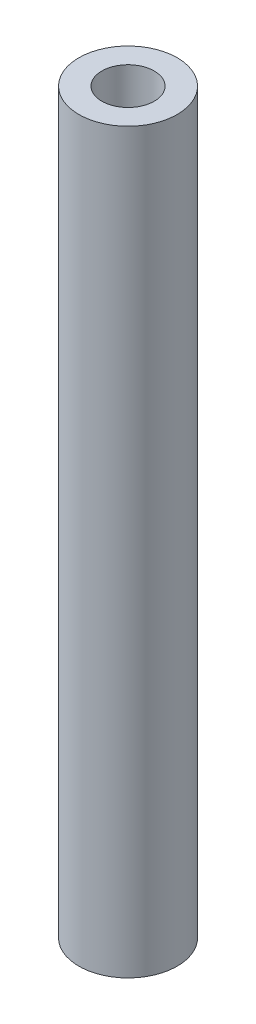
ISO-10303-21;
HEADER;
FILE_DESCRIPTION(('STEP AP214'),'2;1');
FILE_NAME('part.step','',(''),(''),'','','');
FILE_SCHEMA(('AUTOMOTIVE_DESIGN { 1 0 10303 214 1 1 1 1 }'));
ENDSEC;
DATA;
#1=APPLICATION_CONTEXT('core data for automotive mechanical design processes');
#2=APPLICATION_PROTOCOL_DEFINITION('international standard','automotive_design',2000,#1);
#3=PRODUCT_CONTEXT('',#1,'mechanical');
#4=PRODUCT('Part','Part','',(#3));
#5=PRODUCT_RELATED_PRODUCT_CATEGORY('part','',(#4));
#6=PRODUCT_DEFINITION_FORMATION('','',#4);
#7=PRODUCT_DEFINITION_CONTEXT('part definition',#1,'design');
#8=PRODUCT_DEFINITION('design','',#6,#7);
#9=PRODUCT_DEFINITION_SHAPE('','',#8);
#10=(LENGTH_UNIT() NAMED_UNIT(*) SI_UNIT(.MILLI.,.METRE.));
#11=(NAMED_UNIT(*) PLANE_ANGLE_UNIT() SI_UNIT($,.RADIAN.));
#12=(NAMED_UNIT(*) SI_UNIT($,.STERADIAN.) SOLID_ANGLE_UNIT());
#13=UNCERTAINTY_MEASURE_WITH_UNIT(LENGTH_MEASURE(1.E-05),#10,'distance_accuracy_value','');
#14=(GEOMETRIC_REPRESENTATION_CONTEXT(3) GLOBAL_UNCERTAINTY_ASSIGNED_CONTEXT((#13)) GLOBAL_UNIT_ASSIGNED_CONTEXT((#10,
#11,#12)) REPRESENTATION_CONTEXT('',''));
#15=CARTESIAN_POINT('',(0.,0.,0.));
#16=DIRECTION('',(0.,0.,1.));
#17=DIRECTION('',(1.,0.,0.));
#18=AXIS2_PLACEMENT_3D('',#15,#16,#17);
#19=CARTESIAN_POINT('',(0.,45.,0.));
#20=DIRECTION('',(0.,1.,0.));
#21=DIRECTION('',(0.,0.,1.));
#22=AXIS2_PLACEMENT_3D('',#19,#20,#21);
#23=PLANE('',#22);
#24=CARTESIAN_POINT('',(0.,45.,0.));
#25=DIRECTION('',(0.,1.,0.));
#26=DIRECTION('',(0.,0.,1.));
#27=AXIS2_PLACEMENT_3D('',#24,#25,#26);
#28=CIRCLE('',#27,3.);
#29=CARTESIAN_POINT('',(0.,45.,-3.));
#30=VERTEX_POINT('',#29);
#31=EDGE_CURVE('E10',#30,#30,#28,.T.);
#32=ORIENTED_EDGE('',*,*,#31,.T.);
#33=EDGE_LOOP('',(#32));
#34=FACE_BOUND('',#33,.T.);
#35=CARTESIAN_POINT('',(0.,45.,0.));
#36=DIRECTION('',(0.,1.,0.));
#37=DIRECTION('',(0.,0.,1.));
#38=AXIS2_PLACEMENT_3D('',#35,#36,#37);
#39=CIRCLE('',#38,1.6);
#40=CARTESIAN_POINT('',(0.,45.,-1.6));
#41=VERTEX_POINT('',#40);
#42=EDGE_CURVE('E50',#41,#41,#39,.T.);
#43=ORIENTED_EDGE('',*,*,#42,.F.);
#44=EDGE_LOOP('',(#43));
#45=FACE_BOUND('',#44,.T.);
#46=ADVANCED_FACE('F37',(#34,#45),#23,.T.);
#47=CARTESIAN_POINT('',(0.,0.,0.));
#48=DIRECTION('',(0.,1.,0.));
#49=DIRECTION('',(0.,0.,1.));
#50=AXIS2_PLACEMENT_3D('',#47,#48,#49);
#51=PLANE('',#50);
#52=CARTESIAN_POINT('',(0.,0.,0.));
#53=DIRECTION('',(0.,1.,0.));
#54=DIRECTION('',(0.,0.,1.));
#55=AXIS2_PLACEMENT_3D('',#52,#53,#54);
#56=CIRCLE('',#55,3.);
#57=CARTESIAN_POINT('',(0.,0.,-3.));
#58=VERTEX_POINT('',#57);
#59=EDGE_CURVE('E41',#58,#58,#56,.T.);
#60=ORIENTED_EDGE('',*,*,#59,.F.);
#61=EDGE_LOOP('',(#60));
#62=FACE_BOUND('',#61,.T.);
#63=CARTESIAN_POINT('',(0.,0.,0.));
#64=DIRECTION('',(0.,1.,0.));
#65=DIRECTION('',(0.,0.,1.));
#66=AXIS2_PLACEMENT_3D('',#63,#64,#65);
#67=CIRCLE('',#66,1.6);
#68=CARTESIAN_POINT('',(0.,0.,-1.6));
#69=VERTEX_POINT('',#68);
#70=EDGE_CURVE('E52',#69,#69,#67,.T.);
#71=ORIENTED_EDGE('',*,*,#70,.T.);
#72=EDGE_LOOP('',(#71));
#73=FACE_BOUND('',#72,.T.);
#74=ADVANCED_FACE('F64',(#62,#73),#51,.F.);
#75=CARTESIAN_POINT('',(0.,45.,0.));
#76=DIRECTION('',(0.,-1.,0.));
#77=DIRECTION('',(0.,0.,-1.));
#78=AXIS2_PLACEMENT_3D('',#75,#76,#77);
#79=CYLINDRICAL_SURFACE('',#78,3.);
#80=CARTESIAN_POINT('',(0.,45.,-3.));
#81=CARTESIAN_POINT('',(0.,44.53125,-3.));
#82=CARTESIAN_POINT('',(0.,44.0625,-3.));
#83=CARTESIAN_POINT('',(0.,43.125,-3.));
#84=CARTESIAN_POINT('',(0.,42.65625,-3.));
#85=CARTESIAN_POINT('',(0.,41.71875,-3.));
#86=CARTESIAN_POINT('',(0.,41.25,-3.));
#87=CARTESIAN_POINT('',(0.,40.3125,-3.));
#88=CARTESIAN_POINT('',(0.,39.84375,-3.));
#89=CARTESIAN_POINT('',(0.,38.90625,-3.));
#90=CARTESIAN_POINT('',(0.,38.4375,-3.));
#91=CARTESIAN_POINT('',(0.,37.5,-3.));
#92=CARTESIAN_POINT('',(0.,37.03125,-3.));
#93=CARTESIAN_POINT('',(0.,36.09375,-3.));
#94=CARTESIAN_POINT('',(0.,35.625,-3.));
#95=CARTESIAN_POINT('',(0.,34.6875,-3.));
#96=CARTESIAN_POINT('',(0.,34.21875,-3.));
#97=CARTESIAN_POINT('',(0.,33.28125,-3.));
#98=CARTESIAN_POINT('',(0.,32.8125,-3.));
#99=CARTESIAN_POINT('',(0.,31.875,-3.));
#100=CARTESIAN_POINT('',(0.,31.40625,-3.));
#101=CARTESIAN_POINT('',(0.,30.46875,-3.));
#102=CARTESIAN_POINT('',(0.,30.,-3.));
#103=CARTESIAN_POINT('',(0.,29.0625,-3.));
#104=CARTESIAN_POINT('',(0.,28.59375,-3.));
#105=CARTESIAN_POINT('',(0.,27.65625,-3.));
#106=CARTESIAN_POINT('',(0.,27.1875,-3.));
#107=CARTESIAN_POINT('',(0.,26.25,-3.));
#108=CARTESIAN_POINT('',(0.,25.78125,-3.));
#109=CARTESIAN_POINT('',(0.,24.84375,-3.));
#110=CARTESIAN_POINT('',(0.,24.375,-3.));
#111=CARTESIAN_POINT('',(0.,23.4375,-3.));
#112=CARTESIAN_POINT('',(0.,22.96875,-3.));
#113=CARTESIAN_POINT('',(0.,22.03125,-3.));
#114=CARTESIAN_POINT('',(0.,21.5625,-3.));
#115=CARTESIAN_POINT('',(0.,20.625,-3.));
#116=CARTESIAN_POINT('',(0.,20.15625,-3.));
#117=CARTESIAN_POINT('',(0.,19.21875,-3.));
#118=CARTESIAN_POINT('',(0.,18.75,-3.));
#119=CARTESIAN_POINT('',(0.,17.8125,-3.));
#120=CARTESIAN_POINT('',(0.,17.34375,-3.));
#121=CARTESIAN_POINT('',(0.,16.40625,-3.));
#122=CARTESIAN_POINT('',(0.,15.9375,-3.));
#123=CARTESIAN_POINT('',(0.,15.,-3.));
#124=CARTESIAN_POINT('',(0.,14.53125,-3.));
#125=CARTESIAN_POINT('',(0.,13.59375,-3.));
#126=CARTESIAN_POINT('',(0.,13.125,-3.));
#127=CARTESIAN_POINT('',(0.,12.1875,-3.));
#128=CARTESIAN_POINT('',(0.,11.71875,-3.));
#129=CARTESIAN_POINT('',(0.,10.78125,-3.));
#130=CARTESIAN_POINT('',(0.,10.3125,-3.));
#131=CARTESIAN_POINT('',(0.,9.375,-3.));
#132=CARTESIAN_POINT('',(0.,8.90625,-3.));
#133=CARTESIAN_POINT('',(0.,7.96874999999999,-3.));
#134=CARTESIAN_POINT('',(0.,7.5,-3.));
#135=CARTESIAN_POINT('',(0.,6.5625,-3.));
#136=CARTESIAN_POINT('',(0.,6.09375,-3.));
#137=CARTESIAN_POINT('',(0.,5.15625,-3.));
#138=CARTESIAN_POINT('',(0.,4.68749999999999,-3.));
#139=CARTESIAN_POINT('',(0.,3.74999999999999,-3.));
#140=CARTESIAN_POINT('',(0.,3.28124999999999,-3.));
#141=CARTESIAN_POINT('',(0.,2.34374999999999,-3.));
#142=CARTESIAN_POINT('',(0.,1.87499999999999,-3.));
#143=CARTESIAN_POINT('',(0.,0.937499999999992,-3.));
#144=CARTESIAN_POINT('',(0.,0.468749999999993,-3.));
#145=CARTESIAN_POINT('',(0.,0.,-3.));
#146=B_SPLINE_CURVE_WITH_KNOTS('',3,(#80,#81,#82,#83,#84,#85,#86,#87,#88,#89,#90,#91,#92,#93,
#94,#95,#96,#97,#98,#99,#100,#101,#102,#103,#104,#105,#106,#107,#108,#109,#110,#111,#112,#113,
#114,#115,#116,#117,#118,#119,#120,#121,#122,#123,#124,#125,#126,#127,#128,#129,#130,#131,#132,
#133,#134,#135,#136,#137,#138,#139,#140,#141,#142,#143,#144,#145),.UNSPECIFIED.,.F.,.F.,(4,2,2,
2,2,2,2,2,2,2,2,2,2,2,2,2,2,2,2,2,2,2,2,2,2,2,2,2,2,2,2,2,4),(0.,1.40625,2.8125,
4.21875000000001,5.62500000000001,7.03125,8.4375,9.84375000000001,11.25,12.65625,14.0625,
15.46875,16.875,18.28125,19.6875,21.09375,22.5,23.90625,25.3125,26.71875,28.125,29.53125,
30.9375,32.34375,33.75,35.15625,36.5625,37.96875,39.375,40.78125,42.1875,43.59375,45.),.UNSPECIFIED.);
#147=EDGE_CURVE('BSEAM39',#30,#58,#146,.T.);
#148=ORIENTED_EDGE('',*,*,#31,.F.);
#149=ORIENTED_EDGE('',*,*,#59,.T.);
#150=ORIENTED_EDGE('',*,*,#147,.T.);
#151=ORIENTED_EDGE('',*,*,#147,.F.);
#152=EDGE_LOOP('',(#148,#150,#149,#151));
#153=FACE_BOUND('',#152,.T.);
#154=ADVANCED_FACE('F39',(#153),#79,.T.);
#155=CARTESIAN_POINT('',(0.,45.,0.));
#156=DIRECTION('',(0.,-1.,0.));
#157=DIRECTION('',(0.,0.,-1.));
#158=AXIS2_PLACEMENT_3D('',#155,#156,#157);
#159=CYLINDRICAL_SURFACE('',#158,1.6);
#160=CARTESIAN_POINT('',(0.,45.,-1.6));
#161=CARTESIAN_POINT('',(0.,44.53125,-1.6));
#162=CARTESIAN_POINT('',(0.,44.0625,-1.6));
#163=CARTESIAN_POINT('',(0.,43.125,-1.6));
#164=CARTESIAN_POINT('',(0.,42.65625,-1.6));
#165=CARTESIAN_POINT('',(0.,41.71875,-1.6));
#166=CARTESIAN_POINT('',(0.,41.25,-1.6));
#167=CARTESIAN_POINT('',(0.,40.3125,-1.6));
#168=CARTESIAN_POINT('',(0.,39.84375,-1.6));
#169=CARTESIAN_POINT('',(0.,38.90625,-1.6));
#170=CARTESIAN_POINT('',(0.,38.4375,-1.6));
#171=CARTESIAN_POINT('',(0.,37.5,-1.6));
#172=CARTESIAN_POINT('',(0.,37.03125,-1.6));
#173=CARTESIAN_POINT('',(0.,36.09375,-1.6));
#174=CARTESIAN_POINT('',(0.,35.625,-1.6));
#175=CARTESIAN_POINT('',(0.,34.6875,-1.6));
#176=CARTESIAN_POINT('',(0.,34.21875,-1.6));
#177=CARTESIAN_POINT('',(0.,33.28125,-1.6));
#178=CARTESIAN_POINT('',(0.,32.8125,-1.6));
#179=CARTESIAN_POINT('',(0.,31.875,-1.6));
#180=CARTESIAN_POINT('',(0.,31.40625,-1.6));
#181=CARTESIAN_POINT('',(0.,30.46875,-1.6));
#182=CARTESIAN_POINT('',(0.,30.,-1.6));
#183=CARTESIAN_POINT('',(0.,29.0625,-1.6));
#184=CARTESIAN_POINT('',(0.,28.59375,-1.6));
#185=CARTESIAN_POINT('',(0.,27.65625,-1.6));
#186=CARTESIAN_POINT('',(0.,27.1875,-1.6));
#187=CARTESIAN_POINT('',(0.,26.25,-1.6));
#188=CARTESIAN_POINT('',(0.,25.78125,-1.6));
#189=CARTESIAN_POINT('',(0.,24.84375,-1.6));
#190=CARTESIAN_POINT('',(0.,24.375,-1.6));
#191=CARTESIAN_POINT('',(0.,23.4375,-1.6));
#192=CARTESIAN_POINT('',(0.,22.96875,-1.6));
#193=CARTESIAN_POINT('',(0.,22.03125,-1.6));
#194=CARTESIAN_POINT('',(0.,21.5625,-1.6));
#195=CARTESIAN_POINT('',(0.,20.625,-1.6));
#196=CARTESIAN_POINT('',(0.,20.15625,-1.6));
#197=CARTESIAN_POINT('',(0.,19.21875,-1.6));
#198=CARTESIAN_POINT('',(0.,18.75,-1.6));
#199=CARTESIAN_POINT('',(0.,17.8125,-1.6));
#200=CARTESIAN_POINT('',(0.,17.34375,-1.6));
#201=CARTESIAN_POINT('',(0.,16.40625,-1.6));
#202=CARTESIAN_POINT('',(0.,15.9375,-1.6));
#203=CARTESIAN_POINT('',(0.,15.,-1.6));
#204=CARTESIAN_POINT('',(0.,14.53125,-1.6));
#205=CARTESIAN_POINT('',(0.,13.59375,-1.6));
#206=CARTESIAN_POINT('',(0.,13.125,-1.6));
#207=CARTESIAN_POINT('',(0.,12.1875,-1.6));
#208=CARTESIAN_POINT('',(0.,11.71875,-1.6));
#209=CARTESIAN_POINT('',(0.,10.78125,-1.6));
#210=CARTESIAN_POINT('',(0.,10.3125,-1.6));
#211=CARTESIAN_POINT('',(0.,9.375,-1.6));
#212=CARTESIAN_POINT('',(0.,8.90625,-1.6));
#213=CARTESIAN_POINT('',(0.,7.96874999999999,-1.6));
#214=CARTESIAN_POINT('',(0.,7.5,-1.6));
#215=CARTESIAN_POINT('',(0.,6.5625,-1.6));
#216=CARTESIAN_POINT('',(0.,6.09375,-1.6));
#217=CARTESIAN_POINT('',(0.,5.15625,-1.6));
#218=CARTESIAN_POINT('',(0.,4.68749999999999,-1.6));
#219=CARTESIAN_POINT('',(0.,3.74999999999999,-1.6));
#220=CARTESIAN_POINT('',(0.,3.28124999999999,-1.6));
#221=CARTESIAN_POINT('',(0.,2.34374999999999,-1.6));
#222=CARTESIAN_POINT('',(0.,1.87499999999999,-1.6));
#223=CARTESIAN_POINT('',(0.,0.937499999999992,-1.6));
#224=CARTESIAN_POINT('',(0.,0.468749999999993,-1.6));
#225=CARTESIAN_POINT('',(0.,0.,-1.6));
#226=B_SPLINE_CURVE_WITH_KNOTS('',3,(#160,#161,#162,#163,#164,#165,#166,#167,#168,#169,#170,
#171,#172,#173,#174,#175,#176,#177,#178,#179,#180,#181,#182,#183,#184,#185,#186,#187,#188,#189,
#190,#191,#192,#193,#194,#195,#196,#197,#198,#199,#200,#201,#202,#203,#204,#205,#206,#207,#208,
#209,#210,#211,#212,#213,#214,#215,#216,#217,#218,#219,#220,#221,#222,#223,#224,#225),
.UNSPECIFIED.,.F.,.F.,(4,2,2,2,2,2,2,2,2,2,2,2,2,2,2,2,2,2,2,2,2,2,2,2,2,2,2,2,2,2,2,2,4),(0.,
1.40625,2.8125,4.21875000000001,5.62500000000001,7.03125,8.4375,9.84375000000001,11.25,12.65625,
14.0625,15.46875,16.875,18.28125,19.6875,21.09375,22.5,23.90625,25.3125,26.71875,28.125,
29.53125,30.9375,32.34375,33.75,35.15625,36.5625,37.96875,39.375,40.78125,42.1875,43.59375,45.),.UNSPECIFIED.);
#227=EDGE_CURVE('BSEAM60',#41,#69,#226,.T.);
#228=ORIENTED_EDGE('',*,*,#42,.T.);
#229=ORIENTED_EDGE('',*,*,#70,.F.);
#230=ORIENTED_EDGE('',*,*,#227,.T.);
#231=ORIENTED_EDGE('',*,*,#227,.F.);
#232=EDGE_LOOP('',(#228,#230,#229,#231));
#233=FACE_BOUND('',#232,.T.);
#234=ADVANCED_FACE('F60',(#233),#159,.F.);
#235=CLOSED_SHELL('',(#46,#74,#154,#234));
#236=MANIFOLD_SOLID_BREP('B2',#235);
#237=ADVANCED_BREP_SHAPE_REPRESENTATION('',(#18,#236),#14);
#238=SHAPE_DEFINITION_REPRESENTATION(#9,#237);
ENDSEC;
END-ISO-10303-21;
